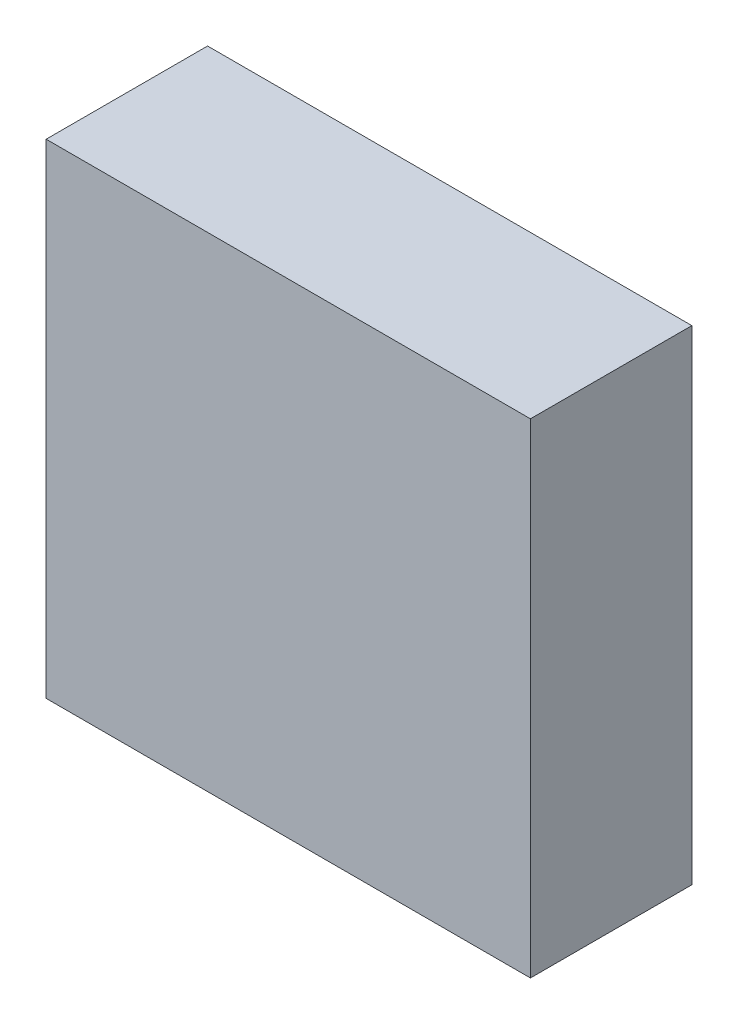
ISO-10303-21;
HEADER;
FILE_DESCRIPTION(('STEP AP214'),'2;1');
FILE_NAME('part.step','',(''),(''),'','','');
FILE_SCHEMA(('AUTOMOTIVE_DESIGN { 1 0 10303 214 1 1 1 1 }'));
ENDSEC;
DATA;
#1=APPLICATION_CONTEXT('core data for automotive mechanical design processes');
#2=APPLICATION_PROTOCOL_DEFINITION('international standard','automotive_design',2000,#1);
#3=PRODUCT_CONTEXT('',#1,'mechanical');
#4=PRODUCT('Part','Part','',(#3));
#5=PRODUCT_RELATED_PRODUCT_CATEGORY('part','',(#4));
#6=PRODUCT_DEFINITION_FORMATION('','',#4);
#7=PRODUCT_DEFINITION_CONTEXT('part definition',#1,'design');
#8=PRODUCT_DEFINITION('design','',#6,#7);
#9=PRODUCT_DEFINITION_SHAPE('','',#8);
#10=(LENGTH_UNIT() NAMED_UNIT(*) SI_UNIT(.MILLI.,.METRE.));
#11=(NAMED_UNIT(*) PLANE_ANGLE_UNIT() SI_UNIT($,.RADIAN.));
#12=(NAMED_UNIT(*) SI_UNIT($,.STERADIAN.) SOLID_ANGLE_UNIT());
#13=UNCERTAINTY_MEASURE_WITH_UNIT(LENGTH_MEASURE(1.E-05),#10,'distance_accuracy_value','');
#14=(GEOMETRIC_REPRESENTATION_CONTEXT(3) GLOBAL_UNCERTAINTY_ASSIGNED_CONTEXT((#13)) GLOBAL_UNIT_ASSIGNED_CONTEXT((#10,
#11,#12)) REPRESENTATION_CONTEXT('',''));
#15=CARTESIAN_POINT('',(0.,0.,0.));
#16=DIRECTION('',(0.,0.,1.));
#17=DIRECTION('',(1.,0.,0.));
#18=AXIS2_PLACEMENT_3D('',#15,#16,#17);
#19=CARTESIAN_POINT('',(15.,-15.,10.));
#20=DIRECTION('',(-1.,0.,0.));
#21=DIRECTION('',(0.,0.,1.));
#22=AXIS2_PLACEMENT_3D('',#19,#20,#21);
#23=PLANE('',#22);
#24=DIRECTION('',(0.,1.,0.));
#25=VECTOR('',#24,1.);
#26=CARTESIAN_POINT('',(15.,-15.,0.));
#27=LINE('',#26,#25);
#28=CARTESIAN_POINT('',(15.,-15.,0.));
#29=VERTEX_POINT('',#28);
#30=CARTESIAN_POINT('',(15.,15.,0.));
#31=VERTEX_POINT('',#30);
#32=EDGE_CURVE('E100',#29,#31,#27,.T.);
#33=ORIENTED_EDGE('',*,*,#32,.T.);
#34=DIRECTION('',(0.,0.,-1.));
#35=VECTOR('',#34,1.);
#36=CARTESIAN_POINT('',(15.,15.,10.));
#37=LINE('',#36,#35);
#38=CARTESIAN_POINT('',(15.,15.,10.));
#39=VERTEX_POINT('',#38);
#40=EDGE_CURVE('E11',#39,#31,#37,.T.);
#41=ORIENTED_EDGE('',*,*,#40,.F.);
#42=DIRECTION('',(0.,1.,0.));
#43=VECTOR('',#42,1.);
#44=CARTESIAN_POINT('',(15.,-15.,10.));
#45=LINE('',#44,#43);
#46=CARTESIAN_POINT('',(15.,-15.,10.));
#47=VERTEX_POINT('',#46);
#48=EDGE_CURVE('E88',#47,#39,#45,.T.);
#49=ORIENTED_EDGE('',*,*,#48,.F.);
#50=DIRECTION('',(0.,0.,-1.));
#51=VECTOR('',#50,1.);
#52=CARTESIAN_POINT('',(15.,-15.,10.));
#53=LINE('',#52,#51);
#54=EDGE_CURVE('E96',#47,#29,#53,.T.);
#55=ORIENTED_EDGE('',*,*,#54,.T.);
#56=EDGE_LOOP('',(#33,#41,#49,#55));
#57=FACE_BOUND('',#56,.T.);
#58=ADVANCED_FACE('F37',(#57),#23,.F.);
#59=CARTESIAN_POINT('',(-15.,15.,10.));
#60=DIRECTION('',(0.,-1.,0.));
#61=DIRECTION('',(0.,0.,-1.));
#62=AXIS2_PLACEMENT_3D('',#59,#60,#61);
#63=PLANE('',#62);
#64=DIRECTION('',(-1.,0.,0.));
#65=VECTOR('',#64,1.);
#66=CARTESIAN_POINT('',(-15.,15.,0.));
#67=LINE('',#66,#65);
#68=CARTESIAN_POINT('',(-15.,15.,0.));
#69=VERTEX_POINT('',#68);
#70=EDGE_CURVE('E92',#31,#69,#67,.T.);
#71=ORIENTED_EDGE('',*,*,#70,.T.);
#72=DIRECTION('',(0.,0.,-1.));
#73=VECTOR('',#72,1.);
#74=CARTESIAN_POINT('',(-15.,15.,10.));
#75=LINE('',#74,#73);
#76=CARTESIAN_POINT('',(-15.,15.,10.));
#77=VERTEX_POINT('',#76);
#78=EDGE_CURVE('E45',#77,#69,#75,.T.);
#79=ORIENTED_EDGE('',*,*,#78,.F.);
#80=DIRECTION('',(-1.,0.,0.));
#81=VECTOR('',#80,1.);
#82=CARTESIAN_POINT('',(-15.,15.,10.));
#83=LINE('',#82,#81);
#84=EDGE_CURVE('E83',#39,#77,#83,.T.);
#85=ORIENTED_EDGE('',*,*,#84,.F.);
#86=ORIENTED_EDGE('',*,*,#40,.T.);
#87=EDGE_LOOP('',(#71,#79,#85,#86));
#88=FACE_BOUND('',#87,.T.);
#89=ADVANCED_FACE('F91',(#88),#63,.F.);
#90=CARTESIAN_POINT('',(-15.,-15.,10.));
#91=DIRECTION('',(1.,0.,0.));
#92=DIRECTION('',(0.,0.,-1.));
#93=AXIS2_PLACEMENT_3D('',#90,#91,#92);
#94=PLANE('',#93);
#95=DIRECTION('',(0.,-1.,0.));
#96=VECTOR('',#95,1.);
#97=CARTESIAN_POINT('',(-15.,-15.,0.));
#98=LINE('',#97,#96);
#99=CARTESIAN_POINT('',(-15.,-15.,0.));
#100=VERTEX_POINT('',#99);
#101=EDGE_CURVE('E70',#69,#100,#98,.T.);
#102=ORIENTED_EDGE('',*,*,#101,.T.);
#103=DIRECTION('',(0.,0.,-1.));
#104=VECTOR('',#103,1.);
#105=CARTESIAN_POINT('',(-15.,-15.,10.));
#106=LINE('',#105,#104);
#107=CARTESIAN_POINT('',(-15.,-15.,10.));
#108=VERTEX_POINT('',#107);
#109=EDGE_CURVE('E93',#108,#100,#106,.T.);
#110=ORIENTED_EDGE('',*,*,#109,.F.);
#111=DIRECTION('',(0.,-1.,0.));
#112=VECTOR('',#111,1.);
#113=CARTESIAN_POINT('',(-15.,-15.,10.));
#114=LINE('',#113,#112);
#115=EDGE_CURVE('E86',#77,#108,#114,.T.);
#116=ORIENTED_EDGE('',*,*,#115,.F.);
#117=ORIENTED_EDGE('',*,*,#78,.T.);
#118=EDGE_LOOP('',(#102,#110,#116,#117));
#119=FACE_BOUND('',#118,.T.);
#120=ADVANCED_FACE('F94',(#119),#94,.F.);
#121=CARTESIAN_POINT('',(-15.,-15.,10.));
#122=DIRECTION('',(0.,1.,0.));
#123=DIRECTION('',(0.,0.,1.));
#124=AXIS2_PLACEMENT_3D('',#121,#122,#123);
#125=PLANE('',#124);
#126=DIRECTION('',(1.,0.,0.));
#127=VECTOR('',#126,1.);
#128=CARTESIAN_POINT('',(-15.,-15.,0.));
#129=LINE('',#128,#127);
#130=EDGE_CURVE('E76',#100,#29,#129,.T.);
#131=ORIENTED_EDGE('',*,*,#130,.T.);
#132=ORIENTED_EDGE('',*,*,#54,.F.);
#133=DIRECTION('',(1.,0.,0.));
#134=VECTOR('',#133,1.);
#135=CARTESIAN_POINT('',(-15.,-15.,10.));
#136=LINE('',#135,#134);
#137=EDGE_CURVE('E53',#108,#47,#136,.T.);
#138=ORIENTED_EDGE('',*,*,#137,.F.);
#139=ORIENTED_EDGE('',*,*,#109,.T.);
#140=EDGE_LOOP('',(#131,#132,#138,#139));
#141=FACE_BOUND('',#140,.T.);
#142=ADVANCED_FACE('F107',(#141),#125,.F.);
#143=CARTESIAN_POINT('',(0.,0.,10.));
#144=DIRECTION('',(0.,0.,-1.));
#145=DIRECTION('',(-1.,0.,0.));
#146=AXIS2_PLACEMENT_3D('',#143,#144,#145);
#147=PLANE('',#146);
#148=ORIENTED_EDGE('',*,*,#48,.T.);
#149=ORIENTED_EDGE('',*,*,#84,.T.);
#150=ORIENTED_EDGE('',*,*,#115,.T.);
#151=ORIENTED_EDGE('',*,*,#137,.T.);
#152=EDGE_LOOP('',(#148,#149,#150,#151));
#153=FACE_BOUND('',#152,.T.);
#154=ADVANCED_FACE('F84',(#153),#147,.F.);
#155=CARTESIAN_POINT('',(0.,0.,0.));
#156=DIRECTION('',(0.,0.,-1.));
#157=DIRECTION('',(-1.,0.,0.));
#158=AXIS2_PLACEMENT_3D('',#155,#156,#157);
#159=PLANE('',#158);
#160=ORIENTED_EDGE('',*,*,#32,.F.);
#161=ORIENTED_EDGE('',*,*,#130,.F.);
#162=ORIENTED_EDGE('',*,*,#101,.F.);
#163=ORIENTED_EDGE('',*,*,#70,.F.);
#164=EDGE_LOOP('',(#160,#161,#162,#163));
#165=FACE_BOUND('',#164,.T.);
#166=ADVANCED_FACE('F110',(#165),#159,.T.);
#167=CLOSED_SHELL('',(#58,#89,#120,#142,#154,#166));
#168=MANIFOLD_SOLID_BREP('B2',#167);
#169=ADVANCED_BREP_SHAPE_REPRESENTATION('',(#18,#168),#14);
#170=SHAPE_DEFINITION_REPRESENTATION(#9,#169);
ENDSEC;
END-ISO-10303-21;
